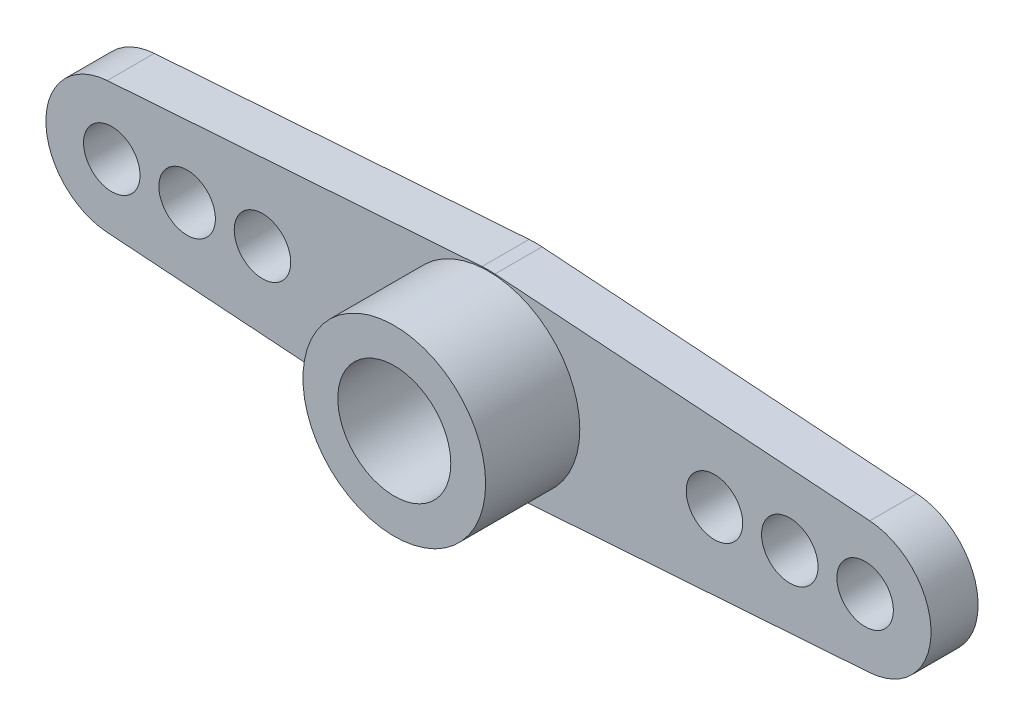
ISO-10303-21;
HEADER;
FILE_DESCRIPTION(('STEP AP214'),'2;1');
FILE_NAME('part.step','',(''),(''),'','','');
FILE_SCHEMA(('AUTOMOTIVE_DESIGN { 1 0 10303 214 1 1 1 1 }'));
ENDSEC;
DATA;
#1=APPLICATION_CONTEXT('core data for automotive mechanical design processes');
#2=APPLICATION_PROTOCOL_DEFINITION('international standard','automotive_design',2000,#1);
#3=PRODUCT_CONTEXT('',#1,'mechanical');
#4=PRODUCT('Part','Part','',(#3));
#5=PRODUCT_RELATED_PRODUCT_CATEGORY('part','',(#4));
#6=PRODUCT_DEFINITION_FORMATION('','',#4);
#7=PRODUCT_DEFINITION_CONTEXT('part definition',#1,'design');
#8=PRODUCT_DEFINITION('design','',#6,#7);
#9=PRODUCT_DEFINITION_SHAPE('','',#8);
#10=(LENGTH_UNIT() NAMED_UNIT(*) SI_UNIT(.MILLI.,.METRE.));
#11=(NAMED_UNIT(*) PLANE_ANGLE_UNIT() SI_UNIT($,.RADIAN.));
#12=(NAMED_UNIT(*) SI_UNIT($,.STERADIAN.) SOLID_ANGLE_UNIT());
#13=UNCERTAINTY_MEASURE_WITH_UNIT(LENGTH_MEASURE(1.E-05),#10,'distance_accuracy_value','');
#14=(GEOMETRIC_REPRESENTATION_CONTEXT(3) GLOBAL_UNCERTAINTY_ASSIGNED_CONTEXT((#13)) GLOBAL_UNIT_ASSIGNED_CONTEXT((#10,
#11,#12)) REPRESENTATION_CONTEXT('',''));
#15=CARTESIAN_POINT('',(0.,0.,0.));
#16=DIRECTION('',(0.,0.,1.));
#17=DIRECTION('',(1.,0.,0.));
#18=AXIS2_PLACEMENT_3D('',#15,#16,#17);
#19=CARTESIAN_POINT('',(0.,0.,2.5));
#20=DIRECTION('',(0.,0.,1.));
#21=DIRECTION('',(1.,0.,0.));
#22=AXIS2_PLACEMENT_3D('',#19,#20,#21);
#23=PLANE('',#22);
#24=CARTESIAN_POINT('',(-20.,0.,2.5));
#25=DIRECTION('',(0.,0.,1.));
#26=DIRECTION('',(-1.,0.,0.));
#27=AXIS2_PLACEMENT_3D('',#24,#25,#26);
#28=CIRCLE('',#27,1.5);
#29=CARTESIAN_POINT('',(-21.5,0.,2.5));
#30=VERTEX_POINT('',#29);
#31=EDGE_CURVE('E211',#30,#30,#28,.T.);
#32=ORIENTED_EDGE('',*,*,#31,.F.);
#33=EDGE_LOOP('',(#32));
#34=FACE_BOUND('',#33,.T.);
#35=CARTESIAN_POINT('',(-12.,0.,2.5));
#36=DIRECTION('',(0.,0.,1.));
#37=DIRECTION('',(-1.,0.,0.));
#38=AXIS2_PLACEMENT_3D('',#35,#36,#37);
#39=CIRCLE('',#38,1.5);
#40=CARTESIAN_POINT('',(-13.5,0.,2.5));
#41=VERTEX_POINT('',#40);
#42=EDGE_CURVE('E201',#41,#41,#39,.T.);
#43=ORIENTED_EDGE('',*,*,#42,.F.);
#44=EDGE_LOOP('',(#43));
#45=FACE_BOUND('',#44,.T.);
#46=CARTESIAN_POINT('',(12.,0.,2.5));
#47=DIRECTION('',(0.,0.,1.));
#48=DIRECTION('',(1.,0.,0.));
#49=AXIS2_PLACEMENT_3D('',#46,#47,#48);
#50=CIRCLE('',#49,1.5);
#51=CARTESIAN_POINT('',(13.5,0.,2.5));
#52=VERTEX_POINT('',#51);
#53=EDGE_CURVE('E190',#52,#52,#50,.T.);
#54=ORIENTED_EDGE('',*,*,#53,.F.);
#55=EDGE_LOOP('',(#54));
#56=FACE_BOUND('',#55,.T.);
#57=CARTESIAN_POINT('',(20.,0.,2.5));
#58=DIRECTION('',(0.,0.,1.));
#59=DIRECTION('',(1.,0.,0.));
#60=AXIS2_PLACEMENT_3D('',#57,#58,#59);
#61=CIRCLE('',#60,1.5);
#62=CARTESIAN_POINT('',(21.5,0.,2.5));
#63=VERTEX_POINT('',#62);
#64=EDGE_CURVE('E136',#63,#63,#61,.T.);
#65=ORIENTED_EDGE('',*,*,#64,.F.);
#66=EDGE_LOOP('',(#65));
#67=FACE_BOUND('',#66,.T.);
#68=CARTESIAN_POINT('',(0.,0.,2.5));
#69=DIRECTION('',(0.,0.,1.));
#70=DIRECTION('',(1.,0.,0.));
#71=AXIS2_PLACEMENT_3D('',#68,#69,#70);
#72=CIRCLE('',#71,4.9);
#73=CARTESIAN_POINT('',(-0.343000000000001,-4.88798025773427,2.5));
#74=VERTEX_POINT('',#73);
#75=CARTESIAN_POINT('',(0.343000000000001,-4.88798025773427,2.5));
#76=VERTEX_POINT('',#75);
#77=EDGE_CURVE('E147',#74,#76,#72,.T.);
#78=ORIENTED_EDGE('',*,*,#77,.T.);
#79=DIRECTION('',(0.997546991374341,0.0700000000000001,0.));
#80=VECTOR('',#79,1.);
#81=CARTESIAN_POINT('',(0.343000000000001,-4.88798025773427,2.5));
#82=LINE('',#81,#80);
#83=CARTESIAN_POINT('',(20.245,-3.49141446981019,2.5));
#84=VERTEX_POINT('',#83);
#85=EDGE_CURVE('E95',#76,#84,#82,.T.);
#86=ORIENTED_EDGE('',*,*,#85,.T.);
#87=CARTESIAN_POINT('',(20.,0.,2.5));
#88=DIRECTION('',(0.,0.,1.));
#89=DIRECTION('',(1.,0.,0.));
#90=AXIS2_PLACEMENT_3D('',#87,#88,#89);
#91=CIRCLE('',#90,3.5);
#92=CARTESIAN_POINT('',(20.245,3.49141446981019,2.5));
#93=VERTEX_POINT('',#92);
#94=EDGE_CURVE('E162',#84,#93,#91,.T.);
#95=ORIENTED_EDGE('',*,*,#94,.T.);
#96=DIRECTION('',(-0.997546991374341,0.0700000000000002,0.));
#97=VECTOR('',#96,1.);
#98=CARTESIAN_POINT('',(0.343000000000001,4.88798025773428,2.5));
#99=LINE('',#98,#97);
#100=CARTESIAN_POINT('',(0.343000000000001,4.88798025773428,2.5));
#101=VERTEX_POINT('',#100);
#102=EDGE_CURVE('E175',#93,#101,#99,.T.);
#103=ORIENTED_EDGE('',*,*,#102,.T.);
#104=CARTESIAN_POINT('',(0.,0.,2.5));
#105=DIRECTION('',(0.,0.,1.));
#106=DIRECTION('',(1.,0.,0.));
#107=AXIS2_PLACEMENT_3D('',#104,#105,#106);
#108=CIRCLE('',#107,4.9);
#109=CARTESIAN_POINT('',(-0.343000000000001,4.88798025773428,2.5));
#110=VERTEX_POINT('',#109);
#111=EDGE_CURVE('E114',#101,#110,#108,.T.);
#112=ORIENTED_EDGE('',*,*,#111,.T.);
#113=DIRECTION('',(-0.997546991374341,-0.0700000000000002,0.));
#114=VECTOR('',#113,1.);
#115=CARTESIAN_POINT('',(-0.343000000000001,4.88798025773428,2.5));
#116=LINE('',#115,#114);
#117=CARTESIAN_POINT('',(-20.245,3.49141446981019,2.5));
#118=VERTEX_POINT('',#117);
#119=EDGE_CURVE('E108',#110,#118,#116,.T.);
#120=ORIENTED_EDGE('',*,*,#119,.T.);
#121=CARTESIAN_POINT('',(-20.,0.,2.5));
#122=DIRECTION('',(0.,0.,1.));
#123=DIRECTION('',(-1.,0.,0.));
#124=AXIS2_PLACEMENT_3D('',#121,#122,#123);
#125=CIRCLE('',#124,3.5);
#126=CARTESIAN_POINT('',(-20.245,-3.49141446981019,2.5));
#127=VERTEX_POINT('',#126);
#128=EDGE_CURVE('E112',#118,#127,#125,.T.);
#129=ORIENTED_EDGE('',*,*,#128,.T.);
#130=DIRECTION('',(0.997546991374341,-0.0700000000000001,0.));
#131=VECTOR('',#130,1.);
#132=CARTESIAN_POINT('',(-0.343000000000001,-4.88798025773427,2.5));
#133=LINE('',#132,#131);
#134=EDGE_CURVE('E52',#127,#74,#133,.T.);
#135=ORIENTED_EDGE('',*,*,#134,.T.);
#136=EDGE_LOOP('',(#78,#86,#95,#103,#112,#120,#129,#135));
#137=FACE_BOUND('',#136,.T.);
#138=CARTESIAN_POINT('',(16.,0.,2.5));
#139=DIRECTION('',(0.,0.,1.));
#140=DIRECTION('',(1.,0.,0.));
#141=AXIS2_PLACEMENT_3D('',#138,#139,#140);
#142=CIRCLE('',#141,1.5);
#143=CARTESIAN_POINT('',(17.5,0.,2.5));
#144=VERTEX_POINT('',#143);
#145=EDGE_CURVE('E184',#144,#144,#142,.T.);
#146=ORIENTED_EDGE('',*,*,#145,.F.);
#147=EDGE_LOOP('',(#146));
#148=FACE_BOUND('',#147,.T.);
#149=CARTESIAN_POINT('',(-16.,0.,2.5));
#150=DIRECTION('',(0.,0.,1.));
#151=DIRECTION('',(-1.,0.,0.));
#152=AXIS2_PLACEMENT_3D('',#149,#150,#151);
#153=CIRCLE('',#152,1.5);
#154=CARTESIAN_POINT('',(-17.5,0.,2.5));
#155=VERTEX_POINT('',#154);
#156=EDGE_CURVE('E205',#155,#155,#153,.T.);
#157=ORIENTED_EDGE('',*,*,#156,.F.);
#158=EDGE_LOOP('',(#157));
#159=FACE_BOUND('',#158,.T.);
#160=CARTESIAN_POINT('',(0.,0.,2.5));
#161=DIRECTION('',(0.,0.,1.));
#162=DIRECTION('',(1.,0.,0.));
#163=AXIS2_PLACEMENT_3D('',#160,#161,#162);
#164=CIRCLE('',#163,4.85);
#165=CARTESIAN_POINT('',(4.85,0.,2.5));
#166=VERTEX_POINT('',#165);
#167=EDGE_CURVE('E220',#166,#166,#164,.T.);
#168=ORIENTED_EDGE('',*,*,#167,.F.);
#169=EDGE_LOOP('',(#168));
#170=FACE_BOUND('',#169,.T.);
#171=ADVANCED_FACE('F35',(#34,#45,#56,#67,#137,#148,#159,#170),#23,.T.);
#172=CARTESIAN_POINT('',(0.,0.,0.));
#173=DIRECTION('',(0.,0.,1.));
#174=DIRECTION('',(1.,0.,0.));
#175=AXIS2_PLACEMENT_3D('',#172,#173,#174);
#176=PLANE('',#175);
#177=CARTESIAN_POINT('',(0.,0.,0.));
#178=DIRECTION('',(0.,0.,1.));
#179=DIRECTION('',(1.,0.,0.));
#180=AXIS2_PLACEMENT_3D('',#177,#178,#179);
#181=CIRCLE('',#180,4.9);
#182=CARTESIAN_POINT('',(-0.343000000000001,-4.88798025773427,0.));
#183=VERTEX_POINT('',#182);
#184=CARTESIAN_POINT('',(0.343000000000001,-4.88798025773427,0.));
#185=VERTEX_POINT('',#184);
#186=EDGE_CURVE('E132',#183,#185,#181,.T.);
#187=ORIENTED_EDGE('',*,*,#186,.F.);
#188=DIRECTION('',(0.997546991374341,-0.0700000000000001,0.));
#189=VECTOR('',#188,1.);
#190=CARTESIAN_POINT('',(-0.343000000000001,-4.88798025773427,0.));
#191=LINE('',#190,#189);
#192=CARTESIAN_POINT('',(-20.245,-3.49141446981019,0.));
#193=VERTEX_POINT('',#192);
#194=EDGE_CURVE('E87',#193,#183,#191,.T.);
#195=ORIENTED_EDGE('',*,*,#194,.F.);
#196=CARTESIAN_POINT('',(-20.,0.,0.));
#197=DIRECTION('',(0.,0.,1.));
#198=DIRECTION('',(-1.,0.,0.));
#199=AXIS2_PLACEMENT_3D('',#196,#197,#198);
#200=CIRCLE('',#199,3.5);
#201=CARTESIAN_POINT('',(-20.245,3.49141446981019,0.));
#202=VERTEX_POINT('',#201);
#203=EDGE_CURVE('E81',#202,#193,#200,.T.);
#204=ORIENTED_EDGE('',*,*,#203,.F.);
#205=DIRECTION('',(-0.997546991374341,-0.0700000000000002,0.));
#206=VECTOR('',#205,1.);
#207=CARTESIAN_POINT('',(-0.343000000000001,4.88798025773428,0.));
#208=LINE('',#207,#206);
#209=CARTESIAN_POINT('',(-0.343000000000001,4.88798025773428,0.));
#210=VERTEX_POINT('',#209);
#211=EDGE_CURVE('E122',#210,#202,#208,.T.);
#212=ORIENTED_EDGE('',*,*,#211,.F.);
#213=CARTESIAN_POINT('',(0.,0.,0.));
#214=DIRECTION('',(0.,0.,1.));
#215=DIRECTION('',(1.,0.,0.));
#216=AXIS2_PLACEMENT_3D('',#213,#214,#215);
#217=CIRCLE('',#216,4.9);
#218=CARTESIAN_POINT('',(0.343000000000001,4.88798025773428,0.));
#219=VERTEX_POINT('',#218);
#220=EDGE_CURVE('E142',#219,#210,#217,.T.);
#221=ORIENTED_EDGE('',*,*,#220,.F.);
#222=DIRECTION('',(-0.997546991374341,0.0700000000000002,0.));
#223=VECTOR('',#222,1.);
#224=CARTESIAN_POINT('',(0.343000000000001,4.88798025773428,0.));
#225=LINE('',#224,#223);
#226=CARTESIAN_POINT('',(20.245,3.49141446981019,0.));
#227=VERTEX_POINT('',#226);
#228=EDGE_CURVE('E140',#227,#219,#225,.T.);
#229=ORIENTED_EDGE('',*,*,#228,.F.);
#230=CARTESIAN_POINT('',(20.,0.,0.));
#231=DIRECTION('',(0.,0.,1.));
#232=DIRECTION('',(1.,0.,0.));
#233=AXIS2_PLACEMENT_3D('',#230,#231,#232);
#234=CIRCLE('',#233,3.5);
#235=CARTESIAN_POINT('',(20.245,-3.49141446981019,0.));
#236=VERTEX_POINT('',#235);
#237=EDGE_CURVE('E138',#236,#227,#234,.T.);
#238=ORIENTED_EDGE('',*,*,#237,.F.);
#239=DIRECTION('',(0.997546991374341,0.0700000000000001,0.));
#240=VECTOR('',#239,1.);
#241=CARTESIAN_POINT('',(0.343000000000001,-4.88798025773427,0.));
#242=LINE('',#241,#240);
#243=EDGE_CURVE('E135',#185,#236,#242,.T.);
#244=ORIENTED_EDGE('',*,*,#243,.F.);
#245=EDGE_LOOP('',(#187,#195,#204,#212,#221,#229,#238,#244));
#246=FACE_BOUND('',#245,.T.);
#247=CARTESIAN_POINT('',(20.,0.,0.));
#248=DIRECTION('',(0.,0.,1.));
#249=DIRECTION('',(1.,0.,0.));
#250=AXIS2_PLACEMENT_3D('',#247,#248,#249);
#251=CIRCLE('',#250,1.5);
#252=CARTESIAN_POINT('',(21.5,0.,0.));
#253=VERTEX_POINT('',#252);
#254=EDGE_CURVE('E181',#253,#253,#251,.T.);
#255=ORIENTED_EDGE('',*,*,#254,.T.);
#256=EDGE_LOOP('',(#255));
#257=FACE_BOUND('',#256,.T.);
#258=CARTESIAN_POINT('',(16.,0.,0.));
#259=DIRECTION('',(0.,0.,1.));
#260=DIRECTION('',(1.,0.,0.));
#261=AXIS2_PLACEMENT_3D('',#258,#259,#260);
#262=CIRCLE('',#261,1.5);
#263=CARTESIAN_POINT('',(17.5,0.,0.));
#264=VERTEX_POINT('',#263);
#265=EDGE_CURVE('E187',#264,#264,#262,.T.);
#266=ORIENTED_EDGE('',*,*,#265,.T.);
#267=EDGE_LOOP('',(#266));
#268=FACE_BOUND('',#267,.T.);
#269=CARTESIAN_POINT('',(12.,0.,0.));
#270=DIRECTION('',(0.,0.,1.));
#271=DIRECTION('',(1.,0.,0.));
#272=AXIS2_PLACEMENT_3D('',#269,#270,#271);
#273=CIRCLE('',#272,1.5);
#274=CARTESIAN_POINT('',(13.5,0.,0.));
#275=VERTEX_POINT('',#274);
#276=EDGE_CURVE('E193',#275,#275,#273,.T.);
#277=ORIENTED_EDGE('',*,*,#276,.T.);
#278=EDGE_LOOP('',(#277));
#279=FACE_BOUND('',#278,.T.);
#280=CARTESIAN_POINT('',(0.,0.,0.));
#281=DIRECTION('',(0.,0.,1.));
#282=DIRECTION('',(1.,0.,0.));
#283=AXIS2_PLACEMENT_3D('',#280,#281,#282);
#284=CIRCLE('',#283,3.);
#285=CARTESIAN_POINT('',(3.,0.,0.));
#286=VERTEX_POINT('',#285);
#287=EDGE_CURVE('E196',#286,#286,#284,.T.);
#288=ORIENTED_EDGE('',*,*,#287,.T.);
#289=EDGE_LOOP('',(#288));
#290=FACE_BOUND('',#289,.T.);
#291=CARTESIAN_POINT('',(-12.,0.,0.));
#292=DIRECTION('',(0.,0.,1.));
#293=DIRECTION('',(-1.,0.,0.));
#294=AXIS2_PLACEMENT_3D('',#291,#292,#293);
#295=CIRCLE('',#294,1.5);
#296=CARTESIAN_POINT('',(-13.5,0.,0.));
#297=VERTEX_POINT('',#296);
#298=EDGE_CURVE('E202',#297,#297,#295,.T.);
#299=ORIENTED_EDGE('',*,*,#298,.T.);
#300=EDGE_LOOP('',(#299));
#301=FACE_BOUND('',#300,.T.);
#302=CARTESIAN_POINT('',(-16.,0.,0.));
#303=DIRECTION('',(0.,0.,1.));
#304=DIRECTION('',(-1.,0.,0.));
#305=AXIS2_PLACEMENT_3D('',#302,#303,#304);
#306=CIRCLE('',#305,1.5);
#307=CARTESIAN_POINT('',(-17.5,0.,0.));
#308=VERTEX_POINT('',#307);
#309=EDGE_CURVE('E208',#308,#308,#306,.T.);
#310=ORIENTED_EDGE('',*,*,#309,.T.);
#311=EDGE_LOOP('',(#310));
#312=FACE_BOUND('',#311,.T.);
#313=CARTESIAN_POINT('',(-20.,0.,0.));
#314=DIRECTION('',(0.,0.,1.));
#315=DIRECTION('',(-1.,0.,0.));
#316=AXIS2_PLACEMENT_3D('',#313,#314,#315);
#317=CIRCLE('',#316,1.5);
#318=CARTESIAN_POINT('',(-21.5,0.,0.));
#319=VERTEX_POINT('',#318);
#320=EDGE_CURVE('E214',#319,#319,#317,.T.);
#321=ORIENTED_EDGE('',*,*,#320,.T.);
#322=EDGE_LOOP('',(#321));
#323=FACE_BOUND('',#322,.T.);
#324=ADVANCED_FACE('F166',(#246,#257,#268,#279,#290,#301,#312,#323),#176,.F.);
#325=CARTESIAN_POINT('',(0.,0.,2.5));
#326=DIRECTION('',(0.,0.,-1.));
#327=DIRECTION('',(-1.,0.,0.));
#328=AXIS2_PLACEMENT_3D('',#325,#326,#327);
#329=CYLINDRICAL_SURFACE('',#328,4.9);
#330=ORIENTED_EDGE('',*,*,#186,.T.);
#331=DIRECTION('',(0.,0.,-1.));
#332=VECTOR('',#331,1.);
#333=CARTESIAN_POINT('',(0.343000000000001,-4.88798025773427,2.5));
#334=LINE('',#333,#332);
#335=EDGE_CURVE('E11',#76,#185,#334,.T.);
#336=ORIENTED_EDGE('',*,*,#335,.F.);
#337=ORIENTED_EDGE('',*,*,#77,.F.);
#338=DIRECTION('',(0.,0.,-1.));
#339=VECTOR('',#338,1.);
#340=CARTESIAN_POINT('',(-0.343000000000001,-4.88798025773427,2.5));
#341=LINE('',#340,#339);
#342=EDGE_CURVE('E128',#74,#183,#341,.T.);
#343=ORIENTED_EDGE('',*,*,#342,.T.);
#344=EDGE_LOOP('',(#330,#336,#337,#343));
#345=FACE_BOUND('',#344,.T.);
#346=ADVANCED_FACE('F37',(#345),#329,.T.);
#347=CARTESIAN_POINT('',(0.343000000000001,-4.88798025773427,2.5));
#348=DIRECTION('',(-0.0700000000000001,0.997546991374341,0.));
#349=DIRECTION('',(-0.997546991374341,-0.0700000000000001,0.));
#350=AXIS2_PLACEMENT_3D('',#347,#348,#349);
#351=PLANE('',#350);
#352=ORIENTED_EDGE('',*,*,#243,.T.);
#353=DIRECTION('',(0.,0.,-1.));
#354=VECTOR('',#353,1.);
#355=CARTESIAN_POINT('',(20.245,-3.49141446981019,2.5));
#356=LINE('',#355,#354);
#357=EDGE_CURVE('E44',#84,#236,#356,.T.);
#358=ORIENTED_EDGE('',*,*,#357,.F.);
#359=ORIENTED_EDGE('',*,*,#85,.F.);
#360=ORIENTED_EDGE('',*,*,#335,.T.);
#361=EDGE_LOOP('',(#352,#358,#359,#360));
#362=FACE_BOUND('',#361,.T.);
#363=ADVANCED_FACE('F271',(#362),#351,.F.);
#364=CARTESIAN_POINT('',(20.,0.,2.5));
#365=DIRECTION('',(0.,0.,-1.));
#366=DIRECTION('',(-1.,0.,0.));
#367=AXIS2_PLACEMENT_3D('',#364,#365,#366);
#368=CYLINDRICAL_SURFACE('',#367,3.5);
#369=ORIENTED_EDGE('',*,*,#237,.T.);
#370=DIRECTION('',(0.,0.,-1.));
#371=VECTOR('',#370,1.);
#372=CARTESIAN_POINT('',(20.245,3.49141446981019,2.5));
#373=LINE('',#372,#371);
#374=EDGE_CURVE('E154',#93,#227,#373,.T.);
#375=ORIENTED_EDGE('',*,*,#374,.F.);
#376=ORIENTED_EDGE('',*,*,#94,.F.);
#377=ORIENTED_EDGE('',*,*,#357,.T.);
#378=EDGE_LOOP('',(#369,#375,#376,#377));
#379=FACE_BOUND('',#378,.T.);
#380=ADVANCED_FACE('F160',(#379),#368,.T.);
#381=CARTESIAN_POINT('',(0.343000000000001,4.88798025773428,2.5));
#382=DIRECTION('',(-0.0700000000000002,-0.997546991374341,0.));
#383=DIRECTION('',(0.997546991374341,-0.0700000000000002,0.));
#384=AXIS2_PLACEMENT_3D('',#381,#382,#383);
#385=PLANE('',#384);
#386=ORIENTED_EDGE('',*,*,#228,.T.);
#387=DIRECTION('',(0.,0.,-1.));
#388=VECTOR('',#387,1.);
#389=CARTESIAN_POINT('',(0.343000000000001,4.88798025773428,2.5));
#390=LINE('',#389,#388);
#391=EDGE_CURVE('E151',#101,#219,#390,.T.);
#392=ORIENTED_EDGE('',*,*,#391,.F.);
#393=ORIENTED_EDGE('',*,*,#102,.F.);
#394=ORIENTED_EDGE('',*,*,#374,.T.);
#395=EDGE_LOOP('',(#386,#392,#393,#394));
#396=FACE_BOUND('',#395,.T.);
#397=ADVANCED_FACE('F171',(#396),#385,.F.);
#398=CARTESIAN_POINT('',(0.,0.,2.5));
#399=DIRECTION('',(0.,0.,-1.));
#400=DIRECTION('',(-1.,0.,0.));
#401=AXIS2_PLACEMENT_3D('',#398,#399,#400);
#402=CYLINDRICAL_SURFACE('',#401,4.9);
#403=ORIENTED_EDGE('',*,*,#220,.T.);
#404=DIRECTION('',(0.,0.,-1.));
#405=VECTOR('',#404,1.);
#406=CARTESIAN_POINT('',(-0.343000000000001,4.88798025773428,2.5));
#407=LINE('',#406,#405);
#408=EDGE_CURVE('E123',#110,#210,#407,.T.);
#409=ORIENTED_EDGE('',*,*,#408,.F.);
#410=ORIENTED_EDGE('',*,*,#111,.F.);
#411=ORIENTED_EDGE('',*,*,#391,.T.);
#412=EDGE_LOOP('',(#403,#409,#410,#411));
#413=FACE_BOUND('',#412,.T.);
#414=ADVANCED_FACE('F174',(#413),#402,.T.);
#415=CARTESIAN_POINT('',(-0.343000000000001,4.88798025773428,2.5));
#416=DIRECTION('',(0.0700000000000002,-0.997546991374341,0.));
#417=DIRECTION('',(0.997546991374341,0.0700000000000002,0.));
#418=AXIS2_PLACEMENT_3D('',#415,#416,#417);
#419=PLANE('',#418);
#420=ORIENTED_EDGE('',*,*,#211,.T.);
#421=DIRECTION('',(0.,0.,-1.));
#422=VECTOR('',#421,1.);
#423=CARTESIAN_POINT('',(-20.245,3.49141446981019,2.5));
#424=LINE('',#423,#422);
#425=EDGE_CURVE('E119',#118,#202,#424,.T.);
#426=ORIENTED_EDGE('',*,*,#425,.F.);
#427=ORIENTED_EDGE('',*,*,#119,.F.);
#428=ORIENTED_EDGE('',*,*,#408,.T.);
#429=EDGE_LOOP('',(#420,#426,#427,#428));
#430=FACE_BOUND('',#429,.T.);
#431=ADVANCED_FACE('F120',(#430),#419,.F.);
#432=CARTESIAN_POINT('',(-20.,0.,2.5));
#433=DIRECTION('',(0.,0.,-1.));
#434=DIRECTION('',(-1.,0.,0.));
#435=AXIS2_PLACEMENT_3D('',#432,#433,#434);
#436=CYLINDRICAL_SURFACE('',#435,3.5);
#437=ORIENTED_EDGE('',*,*,#203,.T.);
#438=DIRECTION('',(0.,0.,-1.));
#439=VECTOR('',#438,1.);
#440=CARTESIAN_POINT('',(-20.245,-3.49141446981019,2.5));
#441=LINE('',#440,#439);
#442=EDGE_CURVE('E124',#127,#193,#441,.T.);
#443=ORIENTED_EDGE('',*,*,#442,.F.);
#444=ORIENTED_EDGE('',*,*,#128,.F.);
#445=ORIENTED_EDGE('',*,*,#425,.T.);
#446=EDGE_LOOP('',(#437,#443,#444,#445));
#447=FACE_BOUND('',#446,.T.);
#448=ADVANCED_FACE('F126',(#447),#436,.T.);
#449=CARTESIAN_POINT('',(-0.343000000000001,-4.88798025773427,2.5));
#450=DIRECTION('',(0.0700000000000001,0.997546991374341,0.));
#451=DIRECTION('',(-0.997546991374341,0.0700000000000001,0.));
#452=AXIS2_PLACEMENT_3D('',#449,#450,#451);
#453=PLANE('',#452);
#454=ORIENTED_EDGE('',*,*,#194,.T.);
#455=ORIENTED_EDGE('',*,*,#342,.F.);
#456=ORIENTED_EDGE('',*,*,#134,.F.);
#457=ORIENTED_EDGE('',*,*,#442,.T.);
#458=EDGE_LOOP('',(#454,#455,#456,#457));
#459=FACE_BOUND('',#458,.T.);
#460=ADVANCED_FACE('F259',(#459),#453,.F.);
#461=CARTESIAN_POINT('',(20.,0.,2.5));
#462=DIRECTION('',(0.,0.,-1.));
#463=DIRECTION('',(-1.,0.,0.));
#464=AXIS2_PLACEMENT_3D('',#461,#462,#463);
#465=CYLINDRICAL_SURFACE('',#464,1.5);
#466=ORIENTED_EDGE('',*,*,#64,.T.);
#467=EDGE_LOOP('',(#466));
#468=FACE_BOUND('',#467,.T.);
#469=ORIENTED_EDGE('',*,*,#254,.F.);
#470=EDGE_LOOP('',(#469));
#471=FACE_BOUND('',#470,.T.);
#472=ADVANCED_FACE('F256',(#468,#471),#465,.F.);
#473=CARTESIAN_POINT('',(16.,0.,2.5));
#474=DIRECTION('',(0.,0.,-1.));
#475=DIRECTION('',(-1.,0.,0.));
#476=AXIS2_PLACEMENT_3D('',#473,#474,#475);
#477=CYLINDRICAL_SURFACE('',#476,1.5);
#478=ORIENTED_EDGE('',*,*,#145,.T.);
#479=EDGE_LOOP('',(#478));
#480=FACE_BOUND('',#479,.T.);
#481=ORIENTED_EDGE('',*,*,#265,.F.);
#482=EDGE_LOOP('',(#481));
#483=FACE_BOUND('',#482,.T.);
#484=ADVANCED_FACE('F331',(#480,#483),#477,.F.);
#485=CARTESIAN_POINT('',(12.,0.,2.5));
#486=DIRECTION('',(0.,0.,-1.));
#487=DIRECTION('',(-1.,0.,0.));
#488=AXIS2_PLACEMENT_3D('',#485,#486,#487);
#489=CYLINDRICAL_SURFACE('',#488,1.5);
#490=ORIENTED_EDGE('',*,*,#53,.T.);
#491=EDGE_LOOP('',(#490));
#492=FACE_BOUND('',#491,.T.);
#493=ORIENTED_EDGE('',*,*,#276,.F.);
#494=EDGE_LOOP('',(#493));
#495=FACE_BOUND('',#494,.T.);
#496=ADVANCED_FACE('F339',(#492,#495),#489,.F.);
#497=CARTESIAN_POINT('',(0.,0.,2.5));
#498=DIRECTION('',(0.,0.,-1.));
#499=DIRECTION('',(-1.,0.,0.));
#500=AXIS2_PLACEMENT_3D('',#497,#498,#499);
#501=CYLINDRICAL_SURFACE('',#500,3.);
#502=ORIENTED_EDGE('',*,*,#287,.F.);
#503=EDGE_LOOP('',(#502));
#504=FACE_BOUND('',#503,.T.);
#505=CARTESIAN_POINT('',(0.,0.,7.5));
#506=DIRECTION('',(0.,0.,1.));
#507=DIRECTION('',(1.,0.,0.));
#508=AXIS2_PLACEMENT_3D('',#505,#506,#507);
#509=CIRCLE('',#508,3.);
#510=CARTESIAN_POINT('',(3.,0.,7.5));
#511=VERTEX_POINT('',#510);
#512=EDGE_CURVE('E223',#511,#511,#509,.T.);
#513=ORIENTED_EDGE('',*,*,#512,.T.);
#514=EDGE_LOOP('',(#513));
#515=FACE_BOUND('',#514,.T.);
#516=ADVANCED_FACE('F229',(#504,#515),#501,.F.);
#517=CARTESIAN_POINT('',(-12.,0.,2.5));
#518=DIRECTION('',(0.,0.,-1.));
#519=DIRECTION('',(-1.,0.,0.));
#520=AXIS2_PLACEMENT_3D('',#517,#518,#519);
#521=CYLINDRICAL_SURFACE('',#520,1.5);
#522=ORIENTED_EDGE('',*,*,#42,.T.);
#523=EDGE_LOOP('',(#522));
#524=FACE_BOUND('',#523,.T.);
#525=ORIENTED_EDGE('',*,*,#298,.F.);
#526=EDGE_LOOP('',(#525));
#527=FACE_BOUND('',#526,.T.);
#528=ADVANCED_FACE('F356',(#524,#527),#521,.F.);
#529=CARTESIAN_POINT('',(-16.,0.,2.5));
#530=DIRECTION('',(0.,0.,-1.));
#531=DIRECTION('',(-1.,0.,0.));
#532=AXIS2_PLACEMENT_3D('',#529,#530,#531);
#533=CYLINDRICAL_SURFACE('',#532,1.5);
#534=ORIENTED_EDGE('',*,*,#156,.T.);
#535=EDGE_LOOP('',(#534));
#536=FACE_BOUND('',#535,.T.);
#537=ORIENTED_EDGE('',*,*,#309,.F.);
#538=EDGE_LOOP('',(#537));
#539=FACE_BOUND('',#538,.T.);
#540=ADVANCED_FACE('F243',(#536,#539),#533,.F.);
#541=CARTESIAN_POINT('',(-20.,0.,2.5));
#542=DIRECTION('',(0.,0.,-1.));
#543=DIRECTION('',(-1.,0.,0.));
#544=AXIS2_PLACEMENT_3D('',#541,#542,#543);
#545=CYLINDRICAL_SURFACE('',#544,1.5);
#546=ORIENTED_EDGE('',*,*,#31,.T.);
#547=EDGE_LOOP('',(#546));
#548=FACE_BOUND('',#547,.T.);
#549=ORIENTED_EDGE('',*,*,#320,.F.);
#550=EDGE_LOOP('',(#549));
#551=FACE_BOUND('',#550,.T.);
#552=ADVANCED_FACE('F234',(#548,#551),#545,.F.);
#553=CARTESIAN_POINT('',(0.,0.,7.5));
#554=DIRECTION('',(0.,0.,1.));
#555=DIRECTION('',(1.,0.,0.));
#556=AXIS2_PLACEMENT_3D('',#553,#554,#555);
#557=PLANE('',#556);
#558=CARTESIAN_POINT('',(0.,0.,7.5));
#559=DIRECTION('',(0.,0.,1.));
#560=DIRECTION('',(1.,0.,0.));
#561=AXIS2_PLACEMENT_3D('',#558,#559,#560);
#562=CIRCLE('',#561,4.85);
#563=CARTESIAN_POINT('',(4.85,0.,7.5));
#564=VERTEX_POINT('',#563);
#565=EDGE_CURVE('E217',#564,#564,#562,.T.);
#566=ORIENTED_EDGE('',*,*,#565,.T.);
#567=EDGE_LOOP('',(#566));
#568=FACE_BOUND('',#567,.T.);
#569=ORIENTED_EDGE('',*,*,#512,.F.);
#570=EDGE_LOOP('',(#569));
#571=FACE_BOUND('',#570,.T.);
#572=ADVANCED_FACE('F231',(#568,#571),#557,.T.);
#573=CARTESIAN_POINT('',(0.,0.,7.5));
#574=DIRECTION('',(0.,0.,-1.));
#575=DIRECTION('',(-1.,0.,0.));
#576=AXIS2_PLACEMENT_3D('',#573,#574,#575);
#577=CYLINDRICAL_SURFACE('',#576,4.85);
#578=ORIENTED_EDGE('',*,*,#565,.F.);
#579=EDGE_LOOP('',(#578));
#580=FACE_BOUND('',#579,.T.);
#581=ORIENTED_EDGE('',*,*,#167,.T.);
#582=EDGE_LOOP('',(#581));
#583=FACE_BOUND('',#582,.T.);
#584=ADVANCED_FACE('F233',(#580,#583),#577,.T.);
#585=CLOSED_SHELL('',(#171,#324,#346,#363,#380,#397,#414,#431,#448,#460,#472,#484,#496,#516,
#528,#540,#552,#572,#584));
#586=MANIFOLD_SOLID_BREP('B2',#585);
#587=ADVANCED_BREP_SHAPE_REPRESENTATION('',(#18,#586),#14);
#588=SHAPE_DEFINITION_REPRESENTATION(#9,#587);
ENDSEC;
END-ISO-10303-21;
